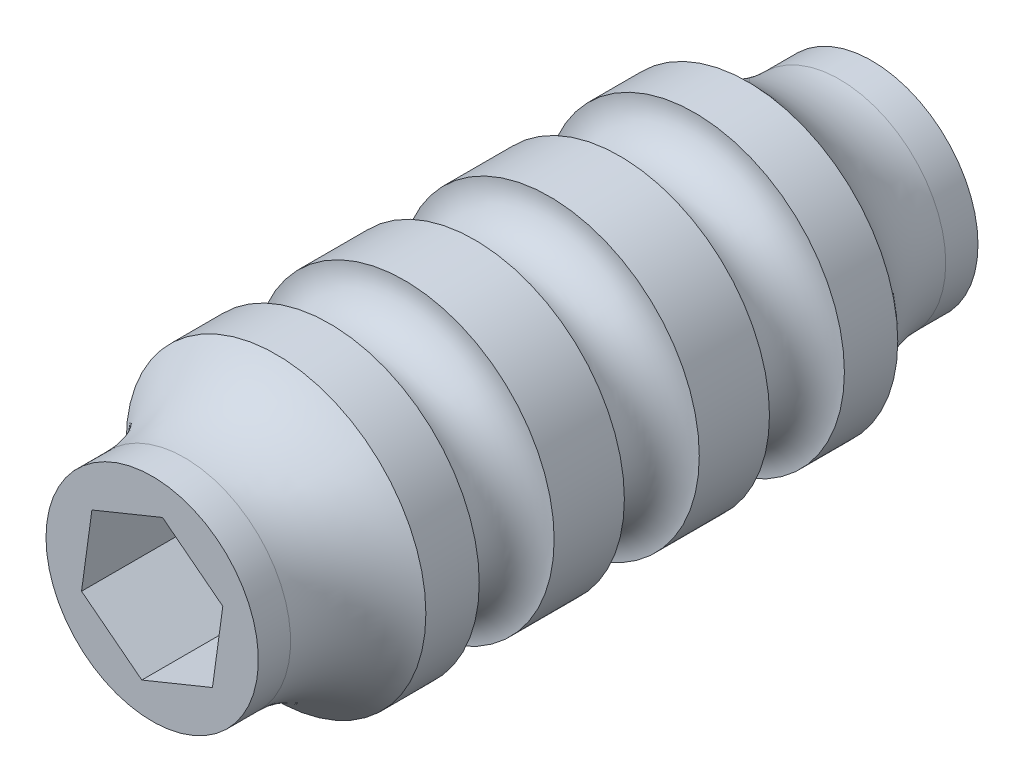
ISO-10303-21;
HEADER;
FILE_DESCRIPTION(('STEP AP214'),'2;1');
FILE_NAME('part.step','',(''),(''),'','','');
FILE_SCHEMA(('AUTOMOTIVE_DESIGN { 1 0 10303 214 1 1 1 1 }'));
ENDSEC;
DATA;
#1=APPLICATION_CONTEXT('core data for automotive mechanical design processes');
#2=APPLICATION_PROTOCOL_DEFINITION('international standard','automotive_design',2000,#1);
#3=PRODUCT_CONTEXT('',#1,'mechanical');
#4=PRODUCT('Part','Part','',(#3));
#5=PRODUCT_RELATED_PRODUCT_CATEGORY('part','',(#4));
#6=PRODUCT_DEFINITION_FORMATION('','',#4);
#7=PRODUCT_DEFINITION_CONTEXT('part definition',#1,'design');
#8=PRODUCT_DEFINITION('design','',#6,#7);
#9=PRODUCT_DEFINITION_SHAPE('','',#8);
#10=(LENGTH_UNIT() NAMED_UNIT(*) SI_UNIT(.MILLI.,.METRE.));
#11=(NAMED_UNIT(*) PLANE_ANGLE_UNIT() SI_UNIT($,.RADIAN.));
#12=(NAMED_UNIT(*) SI_UNIT($,.STERADIAN.) SOLID_ANGLE_UNIT());
#13=UNCERTAINTY_MEASURE_WITH_UNIT(LENGTH_MEASURE(1.E-05),#10,'distance_accuracy_value','');
#14=(GEOMETRIC_REPRESENTATION_CONTEXT(3) GLOBAL_UNCERTAINTY_ASSIGNED_CONTEXT((#13)) GLOBAL_UNIT_ASSIGNED_CONTEXT((#10,
#11,#12)) REPRESENTATION_CONTEXT('',''));
#15=CARTESIAN_POINT('',(0.,0.,0.));
#16=DIRECTION('',(0.,0.,1.));
#17=DIRECTION('',(1.,0.,0.));
#18=AXIS2_PLACEMENT_3D('',#15,#16,#17);
#19=CARTESIAN_POINT('',(0.,0.,0.));
#20=DIRECTION('',(0.,0.,1.));
#21=DIRECTION('',(1.,0.,0.));
#22=AXIS2_PLACEMENT_3D('',#19,#20,#21);
#23=CYLINDRICAL_SURFACE('',#22,12.7);
#24=CARTESIAN_POINT('',(0.,0.,-40.));
#25=DIRECTION('',(0.,0.,1.));
#26=DIRECTION('',(1.,0.,0.));
#27=AXIS2_PLACEMENT_3D('',#24,#25,#26);
#28=CIRCLE('',#27,12.7);
#29=CARTESIAN_POINT('',(12.7,0.,-40.));
#30=VERTEX_POINT('',#29);
#31=EDGE_CURVE('E166',#30,#30,#28,.T.);
#32=ORIENTED_EDGE('',*,*,#31,.T.);
#33=EDGE_LOOP('',(#32));
#34=FACE_BOUND('',#33,.T.);
#35=CARTESIAN_POINT('',(0.,0.,-35.475));
#36=DIRECTION('',(0.,0.,1.));
#37=DIRECTION('',(1.,0.,0.));
#38=AXIS2_PLACEMENT_3D('',#35,#36,#37);
#39=CIRCLE('',#38,12.7);
#40=CARTESIAN_POINT('',(12.7,0.,-35.475));
#41=VERTEX_POINT('',#40);
#42=EDGE_CURVE('E140',#41,#41,#39,.T.);
#43=ORIENTED_EDGE('',*,*,#42,.F.);
#44=EDGE_LOOP('',(#43));
#45=FACE_BOUND('',#44,.T.);
#46=ADVANCED_FACE('F33',(#34,#45),#23,.T.);
#47=CARTESIAN_POINT('',(0.,0.,0.));
#48=DIRECTION('',(0.,0.,1.));
#49=DIRECTION('',(1.,0.,0.));
#50=AXIS2_PLACEMENT_3D('',#47,#48,#49);
#51=CYLINDRICAL_SURFACE('',#50,12.7);
#52=CARTESIAN_POINT('',(0.,0.,-4.525));
#53=DIRECTION('',(0.,0.,1.));
#54=DIRECTION('',(1.,0.,0.));
#55=AXIS2_PLACEMENT_3D('',#52,#53,#54);
#56=CIRCLE('',#55,12.7);
#57=CARTESIAN_POINT('',(12.7,0.,-4.525));
#58=VERTEX_POINT('',#57);
#59=EDGE_CURVE('E160',#58,#58,#56,.T.);
#60=ORIENTED_EDGE('',*,*,#59,.T.);
#61=EDGE_LOOP('',(#60));
#62=FACE_BOUND('',#61,.T.);
#63=CARTESIAN_POINT('',(0.,0.,0.));
#64=DIRECTION('',(0.,0.,1.));
#65=DIRECTION('',(1.,0.,0.));
#66=AXIS2_PLACEMENT_3D('',#63,#64,#65);
#67=CIRCLE('',#66,12.7);
#68=CARTESIAN_POINT('',(12.7,0.,0.));
#69=VERTEX_POINT('',#68);
#70=EDGE_CURVE('E163',#69,#69,#67,.T.);
#71=ORIENTED_EDGE('',*,*,#70,.F.);
#72=EDGE_LOOP('',(#71));
#73=FACE_BOUND('',#72,.T.);
#74=ADVANCED_FACE('F188',(#62,#73),#51,.T.);
#75=CARTESIAN_POINT('',(0.,0.,-7.7));
#76=DIRECTION('',(0.,0.,1.));
#77=DIRECTION('',(1.,0.,0.));
#78=AXIS2_PLACEMENT_3D('',#75,#76,#77);
#79=TOROIDAL_SURFACE('',#78,12.7,3.175);
#80=CARTESIAN_POINT('',(0.,0.,-10.875));
#81=DIRECTION('',(0.,0.,1.));
#82=DIRECTION('',(1.,0.,0.));
#83=AXIS2_PLACEMENT_3D('',#80,#81,#82);
#84=CIRCLE('',#83,12.7);
#85=CARTESIAN_POINT('',(12.7,0.,-10.875));
#86=VERTEX_POINT('',#85);
#87=EDGE_CURVE('E157',#86,#86,#84,.T.);
#88=ORIENTED_EDGE('',*,*,#87,.T.);
#89=EDGE_LOOP('',(#88));
#90=FACE_BOUND('',#89,.T.);
#91=ORIENTED_EDGE('',*,*,#59,.F.);
#92=EDGE_LOOP('',(#91));
#93=FACE_BOUND('',#92,.T.);
#94=ADVANCED_FACE('F193',(#90,#93),#79,.F.);
#95=CARTESIAN_POINT('',(0.,0.,0.));
#96=DIRECTION('',(0.,0.,1.));
#97=DIRECTION('',(1.,0.,0.));
#98=AXIS2_PLACEMENT_3D('',#95,#96,#97);
#99=CYLINDRICAL_SURFACE('',#98,12.7);
#100=CARTESIAN_POINT('',(0.,0.,-16.825));
#101=DIRECTION('',(0.,0.,1.));
#102=DIRECTION('',(1.,0.,0.));
#103=AXIS2_PLACEMENT_3D('',#100,#101,#102);
#104=CIRCLE('',#103,12.7);
#105=CARTESIAN_POINT('',(12.7,0.,-16.825));
#106=VERTEX_POINT('',#105);
#107=EDGE_CURVE('E154',#106,#106,#104,.T.);
#108=ORIENTED_EDGE('',*,*,#107,.T.);
#109=EDGE_LOOP('',(#108));
#110=FACE_BOUND('',#109,.T.);
#111=ORIENTED_EDGE('',*,*,#87,.F.);
#112=EDGE_LOOP('',(#111));
#113=FACE_BOUND('',#112,.T.);
#114=ADVANCED_FACE('F200',(#110,#113),#99,.T.);
#115=CARTESIAN_POINT('',(0.,0.,-20.));
#116=DIRECTION('',(0.,0.,1.));
#117=DIRECTION('',(1.,0.,0.));
#118=AXIS2_PLACEMENT_3D('',#115,#116,#117);
#119=TOROIDAL_SURFACE('',#118,12.7,3.175);
#120=CARTESIAN_POINT('',(0.,0.,-23.175));
#121=DIRECTION('',(0.,0.,1.));
#122=DIRECTION('',(1.,0.,0.));
#123=AXIS2_PLACEMENT_3D('',#120,#121,#122);
#124=CIRCLE('',#123,12.7);
#125=CARTESIAN_POINT('',(12.7,0.,-23.175));
#126=VERTEX_POINT('',#125);
#127=EDGE_CURVE('E151',#126,#126,#124,.T.);
#128=ORIENTED_EDGE('',*,*,#127,.T.);
#129=EDGE_LOOP('',(#128));
#130=FACE_BOUND('',#129,.T.);
#131=ORIENTED_EDGE('',*,*,#107,.F.);
#132=EDGE_LOOP('',(#131));
#133=FACE_BOUND('',#132,.T.);
#134=ADVANCED_FACE('F204',(#130,#133),#119,.F.);
#135=CARTESIAN_POINT('',(0.,0.,0.));
#136=DIRECTION('',(0.,0.,1.));
#137=DIRECTION('',(1.,0.,0.));
#138=AXIS2_PLACEMENT_3D('',#135,#136,#137);
#139=CYLINDRICAL_SURFACE('',#138,12.7);
#140=CARTESIAN_POINT('',(0.,0.,-29.125));
#141=DIRECTION('',(0.,0.,1.));
#142=DIRECTION('',(1.,0.,0.));
#143=AXIS2_PLACEMENT_3D('',#140,#141,#142);
#144=CIRCLE('',#143,12.7);
#145=CARTESIAN_POINT('',(12.7,0.,-29.125));
#146=VERTEX_POINT('',#145);
#147=EDGE_CURVE('E148',#146,#146,#144,.T.);
#148=ORIENTED_EDGE('',*,*,#147,.T.);
#149=EDGE_LOOP('',(#148));
#150=FACE_BOUND('',#149,.T.);
#151=ORIENTED_EDGE('',*,*,#127,.F.);
#152=EDGE_LOOP('',(#151));
#153=FACE_BOUND('',#152,.T.);
#154=ADVANCED_FACE('F208',(#150,#153),#139,.T.);
#155=CARTESIAN_POINT('',(0.,0.,-32.3));
#156=DIRECTION('',(0.,0.,1.));
#157=DIRECTION('',(1.,0.,0.));
#158=AXIS2_PLACEMENT_3D('',#155,#156,#157);
#159=TOROIDAL_SURFACE('',#158,12.7,3.175);
#160=ORIENTED_EDGE('',*,*,#42,.T.);
#161=EDGE_LOOP('',(#160));
#162=FACE_BOUND('',#161,.T.);
#163=ORIENTED_EDGE('',*,*,#147,.F.);
#164=EDGE_LOOP('',(#163));
#165=FACE_BOUND('',#164,.T.);
#166=ADVANCED_FACE('F212',(#162,#165),#159,.F.);
#167=CARTESIAN_POINT('',(-5.10913658499433,3.96359138777016,0.));
#168=DIRECTION('',(-0.377779825487619,0.925895460327214,0.));
#169=DIRECTION('',(-0.925895460327215,-0.377779825487619,0.));
#170=AXIS2_PLACEMENT_3D('',#167,#168,#169);
#171=PLANE('',#170);
#172=DIRECTION('',(0.,0.,-1.));
#173=VECTOR('',#172,1.);
#174=CARTESIAN_POINT('',(-5.10913658499433,3.96359138777016,0.));
#175=LINE('',#174,#173);
#176=CARTESIAN_POINT('',(-5.10913658499433,3.96359138777016,10.5));
#177=VERTEX_POINT('',#176);
#178=CARTESIAN_POINT('',(-5.10913658499433,3.96359138777016,-50.5));
#179=VERTEX_POINT('',#178);
#180=EDGE_CURVE('E48',#177,#179,#175,.T.);
#181=ORIENTED_EDGE('',*,*,#180,.T.);
#182=DIRECTION('',(0.925895460327214,0.377779825487619,0.));
#183=VECTOR('',#182,1.);
#184=CARTESIAN_POINT('',(-5.10913658499433,3.96359138777016,-50.5));
#185=LINE('',#184,#183);
#186=CARTESIAN_POINT('',(0.878002539533004,6.40643776789465,-50.5));
#187=VERTEX_POINT('',#186);
#188=EDGE_CURVE('E134',#179,#187,#185,.T.);
#189=ORIENTED_EDGE('',*,*,#188,.T.);
#190=DIRECTION('',(0.,0.,-1.));
#191=VECTOR('',#190,1.);
#192=CARTESIAN_POINT('',(0.878002539533005,6.40643776789465,0.));
#193=LINE('',#192,#191);
#194=CARTESIAN_POINT('',(0.878002539533004,6.40643776789465,10.5));
#195=VERTEX_POINT('',#194);
#196=EDGE_CURVE('E56',#195,#187,#193,.T.);
#197=ORIENTED_EDGE('',*,*,#196,.F.);
#198=DIRECTION('',(-0.925895460327214,-0.377779825487619,0.));
#199=VECTOR('',#198,1.);
#200=CARTESIAN_POINT('',(0.878002539533004,6.40643776789465,10.5));
#201=LINE('',#200,#199);
#202=EDGE_CURVE('E112',#195,#177,#201,.T.);
#203=ORIENTED_EDGE('',*,*,#202,.T.);
#204=EDGE_LOOP('',(#181,#189,#197,#203));
#205=FACE_BOUND('',#204,.T.);
#206=ADVANCED_FACE('F216',(#205),#171,.F.);
#207=CARTESIAN_POINT('',(-5.98713912452734,-2.44284638012449,0.));
#208=DIRECTION('',(-0.990738902635864,0.135780804254077,0.));
#209=DIRECTION('',(-0.135780804254077,-0.990738902635864,0.));
#210=AXIS2_PLACEMENT_3D('',#207,#208,#209);
#211=PLANE('',#210);
#212=DIRECTION('',(0.,0.,-1.));
#213=VECTOR('',#212,1.);
#214=CARTESIAN_POINT('',(-5.98713912452734,-2.44284638012449,0.));
#215=LINE('',#214,#213);
#216=CARTESIAN_POINT('',(-5.98713912452734,-2.44284638012449,10.5));
#217=VERTEX_POINT('',#216);
#218=CARTESIAN_POINT('',(-5.98713912452734,-2.44284638012449,-50.5));
#219=VERTEX_POINT('',#218);
#220=EDGE_CURVE('E141',#217,#219,#215,.T.);
#221=ORIENTED_EDGE('',*,*,#220,.T.);
#222=DIRECTION('',(0.135780804254077,0.990738902635864,0.));
#223=VECTOR('',#222,1.);
#224=CARTESIAN_POINT('',(-5.98713912452734,-2.44284638012449,-50.5));
#225=LINE('',#224,#223);
#226=EDGE_CURVE('E132',#219,#179,#225,.T.);
#227=ORIENTED_EDGE('',*,*,#226,.T.);
#228=ORIENTED_EDGE('',*,*,#180,.F.);
#229=DIRECTION('',(-0.135780804254077,-0.990738902635864,0.));
#230=VECTOR('',#229,1.);
#231=CARTESIAN_POINT('',(-5.10913658499433,3.96359138777016,10.5));
#232=LINE('',#231,#230);
#233=EDGE_CURVE('E116',#177,#217,#232,.T.);
#234=ORIENTED_EDGE('',*,*,#233,.T.);
#235=EDGE_LOOP('',(#221,#227,#228,#234));
#236=FACE_BOUND('',#235,.T.);
#237=ADVANCED_FACE('F220',(#236),#211,.F.);
#238=CARTESIAN_POINT('',(-0.878002539533006,-6.40643776789464,0.));
#239=DIRECTION('',(-0.612959077148245,-0.790114656073137,0.));
#240=DIRECTION('',(0.790114656073137,-0.612959077148245,0.));
#241=AXIS2_PLACEMENT_3D('',#238,#239,#240);
#242=PLANE('',#241);
#243=DIRECTION('',(0.,0.,-1.));
#244=VECTOR('',#243,1.);
#245=CARTESIAN_POINT('',(-0.878002539533006,-6.40643776789464,0.));
#246=LINE('',#245,#244);
#247=CARTESIAN_POINT('',(-0.878002539533006,-6.40643776789464,10.5));
#248=VERTEX_POINT('',#247);
#249=CARTESIAN_POINT('',(-0.878002539533006,-6.40643776789464,-50.5));
#250=VERTEX_POINT('',#249);
#251=EDGE_CURVE('E98',#248,#250,#246,.T.);
#252=ORIENTED_EDGE('',*,*,#251,.T.);
#253=DIRECTION('',(-0.790114656073137,0.612959077148245,0.));
#254=VECTOR('',#253,1.);
#255=CARTESIAN_POINT('',(-0.878002539533006,-6.40643776789464,-50.5));
#256=LINE('',#255,#254);
#257=EDGE_CURVE('E129',#250,#219,#256,.T.);
#258=ORIENTED_EDGE('',*,*,#257,.T.);
#259=ORIENTED_EDGE('',*,*,#220,.F.);
#260=DIRECTION('',(0.790114656073137,-0.612959077148245,0.));
#261=VECTOR('',#260,1.);
#262=CARTESIAN_POINT('',(-5.98713912452734,-2.44284638012449,10.5));
#263=LINE('',#262,#261);
#264=EDGE_CURVE('E119',#217,#248,#263,.T.);
#265=ORIENTED_EDGE('',*,*,#264,.T.);
#266=EDGE_LOOP('',(#252,#258,#259,#265));
#267=FACE_BOUND('',#266,.T.);
#268=ADVANCED_FACE('F229',(#267),#242,.F.);
#269=CARTESIAN_POINT('',(5.10913658499433,-3.96359138777016,0.));
#270=DIRECTION('',(0.377779825487619,-0.925895460327214,0.));
#271=DIRECTION('',(0.925895460327215,0.377779825487619,0.));
#272=AXIS2_PLACEMENT_3D('',#269,#270,#271);
#273=PLANE('',#272);
#274=DIRECTION('',(0.,0.,-1.));
#275=VECTOR('',#274,1.);
#276=CARTESIAN_POINT('',(5.10913658499433,-3.96359138777016,0.));
#277=LINE('',#276,#275);
#278=CARTESIAN_POINT('',(5.10913658499433,-3.96359138777016,10.5));
#279=VERTEX_POINT('',#278);
#280=CARTESIAN_POINT('',(5.10913658499433,-3.96359138777016,-50.5));
#281=VERTEX_POINT('',#280);
#282=EDGE_CURVE('E87',#279,#281,#277,.T.);
#283=ORIENTED_EDGE('',*,*,#282,.T.);
#284=DIRECTION('',(-0.925895460327214,-0.377779825487619,0.));
#285=VECTOR('',#284,1.);
#286=CARTESIAN_POINT('',(5.10913658499433,-3.96359138777016,-50.5));
#287=LINE('',#286,#285);
#288=EDGE_CURVE('E127',#281,#250,#287,.T.);
#289=ORIENTED_EDGE('',*,*,#288,.T.);
#290=ORIENTED_EDGE('',*,*,#251,.F.);
#291=DIRECTION('',(0.925895460327214,0.377779825487619,0.));
#292=VECTOR('',#291,1.);
#293=CARTESIAN_POINT('',(-0.878002539533006,-6.40643776789464,10.5));
#294=LINE('',#293,#292);
#295=EDGE_CURVE('E102',#248,#279,#294,.T.);
#296=ORIENTED_EDGE('',*,*,#295,.T.);
#297=EDGE_LOOP('',(#283,#289,#290,#296));
#298=FACE_BOUND('',#297,.T.);
#299=ADVANCED_FACE('F103',(#298),#273,.F.);
#300=CARTESIAN_POINT('',(5.98713912452734,2.44284638012449,0.));
#301=DIRECTION('',(0.990738902635864,-0.135780804254077,0.));
#302=DIRECTION('',(0.135780804254077,0.990738902635864,0.));
#303=AXIS2_PLACEMENT_3D('',#300,#301,#302);
#304=PLANE('',#303);
#305=DIRECTION('',(0.,0.,-1.));
#306=VECTOR('',#305,1.);
#307=CARTESIAN_POINT('',(5.98713912452734,2.44284638012449,0.));
#308=LINE('',#307,#306);
#309=CARTESIAN_POINT('',(5.98713912452734,2.44284638012449,10.5));
#310=VERTEX_POINT('',#309);
#311=CARTESIAN_POINT('',(5.98713912452734,2.44284638012449,-50.5));
#312=VERTEX_POINT('',#311);
#313=EDGE_CURVE('E99',#310,#312,#308,.T.);
#314=ORIENTED_EDGE('',*,*,#313,.T.);
#315=DIRECTION('',(-0.135780804254077,-0.990738902635864,0.));
#316=VECTOR('',#315,1.);
#317=CARTESIAN_POINT('',(5.98713912452734,2.44284638012449,-50.5));
#318=LINE('',#317,#316);
#319=EDGE_CURVE('E94',#312,#281,#318,.T.);
#320=ORIENTED_EDGE('',*,*,#319,.T.);
#321=ORIENTED_EDGE('',*,*,#282,.F.);
#322=DIRECTION('',(0.135780804254077,0.990738902635864,0.));
#323=VECTOR('',#322,1.);
#324=CARTESIAN_POINT('',(5.10913658499433,-3.96359138777016,10.5));
#325=LINE('',#324,#323);
#326=EDGE_CURVE('E91',#279,#310,#325,.T.);
#327=ORIENTED_EDGE('',*,*,#326,.T.);
#328=EDGE_LOOP('',(#314,#320,#321,#327));
#329=FACE_BOUND('',#328,.T.);
#330=ADVANCED_FACE('F89',(#329),#304,.F.);
#331=CARTESIAN_POINT('',(0.878002539533005,6.40643776789465,0.));
#332=DIRECTION('',(0.612959077148245,0.790114656073137,0.));
#333=DIRECTION('',(-0.790114656073137,0.612959077148245,0.));
#334=AXIS2_PLACEMENT_3D('',#331,#332,#333);
#335=PLANE('',#334);
#336=ORIENTED_EDGE('',*,*,#196,.T.);
#337=DIRECTION('',(0.790114656073137,-0.612959077148246,0.));
#338=VECTOR('',#337,1.);
#339=CARTESIAN_POINT('',(0.878002539533004,6.40643776789465,-50.5));
#340=LINE('',#339,#338);
#341=EDGE_CURVE('E124',#187,#312,#340,.T.);
#342=ORIENTED_EDGE('',*,*,#341,.T.);
#343=ORIENTED_EDGE('',*,*,#313,.F.);
#344=DIRECTION('',(-0.790114656073137,0.612959077148246,0.));
#345=VECTOR('',#344,1.);
#346=CARTESIAN_POINT('',(5.98713912452734,2.44284638012449,10.5));
#347=LINE('',#346,#345);
#348=EDGE_CURVE('E110',#310,#195,#347,.T.);
#349=ORIENTED_EDGE('',*,*,#348,.T.);
#350=EDGE_LOOP('',(#336,#342,#343,#349));
#351=FACE_BOUND('',#350,.T.);
#352=ADVANCED_FACE('F221',(#351),#335,.F.);
#353=CARTESIAN_POINT('',(0.,0.,-50.5));
#354=DIRECTION('',(0.,0.,-1.));
#355=DIRECTION('',(-1.,0.,0.));
#356=AXIS2_PLACEMENT_3D('',#353,#354,#355);
#357=PLANE('',#356);
#358=CARTESIAN_POINT('',(0.,0.,-50.5));
#359=DIRECTION('',(0.,0.,-1.));
#360=DIRECTION('',(-1.,0.,0.));
#361=AXIS2_PLACEMENT_3D('',#358,#359,#360);
#362=CIRCLE('',#361,9.);
#363=CARTESIAN_POINT('',(9.,0.,-50.5));
#364=VERTEX_POINT('',#363);
#365=EDGE_CURVE('E136',#364,#364,#362,.T.);
#366=ORIENTED_EDGE('',*,*,#365,.T.);
#367=EDGE_LOOP('',(#366));
#368=FACE_BOUND('',#367,.T.);
#369=ORIENTED_EDGE('',*,*,#319,.F.);
#370=ORIENTED_EDGE('',*,*,#341,.F.);
#371=ORIENTED_EDGE('',*,*,#188,.F.);
#372=ORIENTED_EDGE('',*,*,#226,.F.);
#373=ORIENTED_EDGE('',*,*,#257,.F.);
#374=ORIENTED_EDGE('',*,*,#288,.F.);
#375=EDGE_LOOP('',(#369,#370,#371,#372,#373,#374));
#376=FACE_BOUND('',#375,.T.);
#377=ADVANCED_FACE('F224',(#368,#376),#357,.T.);
#378=CARTESIAN_POINT('',(0.,0.,-50.5));
#379=DIRECTION('',(0.,0.,1.));
#380=DIRECTION('',(1.,0.,0.));
#381=AXIS2_PLACEMENT_3D('',#378,#379,#380);
#382=CYLINDRICAL_SURFACE('',#381,9.);
#383=CARTESIAN_POINT('',(0.,0.,-47.7659513261416));
#384=DIRECTION('',(0.,0.,1.));
#385=DIRECTION('',(1.,0.,0.));
#386=AXIS2_PLACEMENT_3D('',#383,#384,#385);
#387=CIRCLE('',#386,9.);
#388=CARTESIAN_POINT('',(9.,0.,-47.7659513261416));
#389=VERTEX_POINT('',#388);
#390=EDGE_CURVE('E41',#389,#389,#387,.F.);
#391=CARTESIAN_POINT('',(9.,0.,-47.7659513261416));
#392=CARTESIAN_POINT('',(9.,0.,-47.7944309998276));
#393=CARTESIAN_POINT('',(9.,0.,-47.8229106735136));
#394=CARTESIAN_POINT('',(9.,0.,-47.8798700208857));
#395=CARTESIAN_POINT('',(9.,0.,-47.9083496945717));
#396=CARTESIAN_POINT('',(9.,0.,-47.9653090419437));
#397=CARTESIAN_POINT('',(9.,0.,-47.9937887156298));
#398=CARTESIAN_POINT('',(9.,0.,-48.0507480630018));
#399=CARTESIAN_POINT('',(9.,0.,-48.0792277366878));
#400=CARTESIAN_POINT('',(9.,0.,-48.1361870840599));
#401=CARTESIAN_POINT('',(9.,0.,-48.1646667577459));
#402=CARTESIAN_POINT('',(9.,0.,-48.221626105118));
#403=CARTESIAN_POINT('',(9.,0.,-48.250105778804));
#404=CARTESIAN_POINT('',(9.,0.,-48.307065126176));
#405=CARTESIAN_POINT('',(9.,0.,-48.3355447998621));
#406=CARTESIAN_POINT('',(9.,0.,-48.3925041472341));
#407=CARTESIAN_POINT('',(9.,0.,-48.4209838209201));
#408=CARTESIAN_POINT('',(9.,0.,-48.4779431682922));
#409=CARTESIAN_POINT('',(9.,0.,-48.5064228419782));
#410=CARTESIAN_POINT('',(9.,0.,-48.5633821893503));
#411=CARTESIAN_POINT('',(9.,0.,-48.5918618630363));
#412=CARTESIAN_POINT('',(9.,0.,-48.6488212104084));
#413=CARTESIAN_POINT('',(9.,0.,-48.6773008840944));
#414=CARTESIAN_POINT('',(9.,0.,-48.7342602314664));
#415=CARTESIAN_POINT('',(9.,0.,-48.7627399051525));
#416=CARTESIAN_POINT('',(9.,0.,-48.8196992525245));
#417=CARTESIAN_POINT('',(9.,0.,-48.8481789262105));
#418=CARTESIAN_POINT('',(9.,0.,-48.9051382735826));
#419=CARTESIAN_POINT('',(9.,0.,-48.9336179472686));
#420=CARTESIAN_POINT('',(9.,0.,-48.9905772946407));
#421=CARTESIAN_POINT('',(9.,0.,-49.0190569683267));
#422=CARTESIAN_POINT('',(9.,0.,-49.0760163156987));
#423=CARTESIAN_POINT('',(9.,0.,-49.1044959893848));
#424=CARTESIAN_POINT('',(9.,0.,-49.1614553367568));
#425=CARTESIAN_POINT('',(9.,0.,-49.1899350104428));
#426=CARTESIAN_POINT('',(9.,0.,-49.2468943578149));
#427=CARTESIAN_POINT('',(9.,0.,-49.2753740315009));
#428=CARTESIAN_POINT('',(9.,0.,-49.332333378873));
#429=CARTESIAN_POINT('',(9.,0.,-49.360813052559));
#430=CARTESIAN_POINT('',(9.,0.,-49.417772399931));
#431=CARTESIAN_POINT('',(9.,0.,-49.4462520736171));
#432=CARTESIAN_POINT('',(9.,0.,-49.5032114209891));
#433=CARTESIAN_POINT('',(9.,0.,-49.5316910946751));
#434=CARTESIAN_POINT('',(9.,0.,-49.5886504420472));
#435=CARTESIAN_POINT('',(9.,0.,-49.6171301157332));
#436=CARTESIAN_POINT('',(9.,0.,-49.6740894631053));
#437=CARTESIAN_POINT('',(9.,0.,-49.7025691367913));
#438=CARTESIAN_POINT('',(9.,0.,-49.7595284841633));
#439=CARTESIAN_POINT('',(9.,0.,-49.7880081578494));
#440=CARTESIAN_POINT('',(9.,0.,-49.8449675052214));
#441=CARTESIAN_POINT('',(9.,0.,-49.8734471789074));
#442=CARTESIAN_POINT('',(9.,0.,-49.9304065262795));
#443=CARTESIAN_POINT('',(9.,0.,-49.9588861999655));
#444=CARTESIAN_POINT('',(9.,0.,-50.0158455473376));
#445=CARTESIAN_POINT('',(9.,0.,-50.0443252210236));
#446=CARTESIAN_POINT('',(9.,0.,-50.1012845683956));
#447=CARTESIAN_POINT('',(9.,0.,-50.1297642420817));
#448=CARTESIAN_POINT('',(9.,0.,-50.1867235894537));
#449=CARTESIAN_POINT('',(9.,0.,-50.2152032631397));
#450=CARTESIAN_POINT('',(9.,0.,-50.2721626105118));
#451=CARTESIAN_POINT('',(9.,0.,-50.3006422841978));
#452=CARTESIAN_POINT('',(9.,0.,-50.3576016315699));
#453=CARTESIAN_POINT('',(9.,0.,-50.3860813052559));
#454=CARTESIAN_POINT('',(9.,0.,-50.4430406526279));
#455=CARTESIAN_POINT('',(9.,0.,-50.471520326314));
#456=CARTESIAN_POINT('',(9.,0.,-50.5));
#457=B_SPLINE_CURVE_WITH_KNOTS('',3,(#391,#392,#393,#394,#395,#396,#397,#398,#399,#400,#401,
#402,#403,#404,#405,#406,#407,#408,#409,#410,#411,#412,#413,#414,#415,#416,#417,#418,#419,#420,
#421,#422,#423,#424,#425,#426,#427,#428,#429,#430,#431,#432,#433,#434,#435,#436,#437,#438,#439,
#440,#441,#442,#443,#444,#445,#446,#447,#448,#449,#450,#451,#452,#453,#454,#455,#456),
.UNSPECIFIED.,.F.,.F.,(4,2,2,2,2,2,2,2,2,2,2,2,2,2,2,2,2,2,2,2,2,2,2,2,2,2,2,2,2,2,2,2,4),(0.,
0.0854390210580785,0.170878042116157,0.256317063174229,0.341756084232307,0.427195105290386,
0.512634126348457,0.598073147406536,0.683512168464607,0.768951189522686,0.854390210580765,
0.939829231638836,1.02526825269691,1.11070727375499,1.19614629481307,1.28158531587114,
1.36702433692921,1.45246335798729,1.53790237904537,1.62334140010344,1.70878042116152,
1.7942194422196,1.87965846327767,1.96509748433575,2.05053650539383,2.1359755264519,
2.22141454750998,2.30685356856805,2.39229258962613,2.47773161068421,2.56317063174228,
2.64860965280036,2.73404867385844),.UNSPECIFIED.);
#458=EDGE_CURVE('BSEAM171',#389,#364,#457,.T.);
#459=ORIENTED_EDGE('',*,*,#390,.T.);
#460=ORIENTED_EDGE('',*,*,#365,.F.);
#461=ORIENTED_EDGE('',*,*,#458,.T.);
#462=ORIENTED_EDGE('',*,*,#458,.F.);
#463=EDGE_LOOP('',(#459,#461,#460,#462));
#464=FACE_BOUND('',#463,.T.);
#465=ADVANCED_FACE('F171',(#464),#382,.T.);
#466=CARTESIAN_POINT('',(0.,0.,10.5));
#467=DIRECTION('',(0.,0.,1.));
#468=DIRECTION('',(1.,0.,0.));
#469=AXIS2_PLACEMENT_3D('',#466,#467,#468);
#470=PLANE('',#469);
#471=CARTESIAN_POINT('',(0.,0.,10.5));
#472=DIRECTION('',(0.,0.,1.));
#473=DIRECTION('',(1.,0.,0.));
#474=AXIS2_PLACEMENT_3D('',#471,#472,#473);
#475=CIRCLE('',#474,9.);
#476=CARTESIAN_POINT('',(-9.,0.,10.5));
#477=VERTEX_POINT('',#476);
#478=EDGE_CURVE('E121',#477,#477,#475,.T.);
#479=ORIENTED_EDGE('',*,*,#478,.T.);
#480=EDGE_LOOP('',(#479));
#481=FACE_BOUND('',#480,.T.);
#482=ORIENTED_EDGE('',*,*,#326,.F.);
#483=ORIENTED_EDGE('',*,*,#295,.F.);
#484=ORIENTED_EDGE('',*,*,#264,.F.);
#485=ORIENTED_EDGE('',*,*,#233,.F.);
#486=ORIENTED_EDGE('',*,*,#202,.F.);
#487=ORIENTED_EDGE('',*,*,#348,.F.);
#488=EDGE_LOOP('',(#482,#483,#484,#485,#486,#487));
#489=FACE_BOUND('',#488,.T.);
#490=ADVANCED_FACE('F108',(#481,#489),#470,.T.);
#491=CARTESIAN_POINT('',(0.,0.,10.5));
#492=DIRECTION('',(0.,0.,-1.));
#493=DIRECTION('',(-1.,0.,0.));
#494=AXIS2_PLACEMENT_3D('',#491,#492,#493);
#495=CYLINDRICAL_SURFACE('',#494,9.);
#496=CARTESIAN_POINT('',(0.,0.,7.76595132614157));
#497=DIRECTION('',(0.,0.,-1.));
#498=DIRECTION('',(-1.,0.,0.));
#499=AXIS2_PLACEMENT_3D('',#496,#497,#498);
#500=CIRCLE('',#499,9.);
#501=CARTESIAN_POINT('',(-9.,0.,7.76595132614157));
#502=VERTEX_POINT('',#501);
#503=EDGE_CURVE('E11',#502,#502,#500,.F.);
#504=CARTESIAN_POINT('',(-9.,0.,7.76595132614157));
#505=CARTESIAN_POINT('',(-9.,0.,7.79443099982759));
#506=CARTESIAN_POINT('',(-9.,0.,7.82291067351362));
#507=CARTESIAN_POINT('',(-9.,0.,7.87987002088567));
#508=CARTESIAN_POINT('',(-9.,0.,7.90834969457169));
#509=CARTESIAN_POINT('',(-9.,0.,7.96530904194374));
#510=CARTESIAN_POINT('',(-9.,0.,7.99378871562977));
#511=CARTESIAN_POINT('',(-9.,0.,8.05074806300182));
#512=CARTESIAN_POINT('',(-9.,0.,8.07922773668785));
#513=CARTESIAN_POINT('',(-9.,0.,8.1361870840599));
#514=CARTESIAN_POINT('',(-9.,0.,8.16466675774592));
#515=CARTESIAN_POINT('',(-9.,0.,8.22162610511797));
#516=CARTESIAN_POINT('',(-9.,0.,8.250105778804));
#517=CARTESIAN_POINT('',(-9.,0.,8.30706512617605));
#518=CARTESIAN_POINT('',(-9.,0.,8.33554479986207));
#519=CARTESIAN_POINT('',(-9.,0.,8.39250414723412));
#520=CARTESIAN_POINT('',(-9.,0.,8.42098382092015));
#521=CARTESIAN_POINT('',(-9.,0.,8.4779431682922));
#522=CARTESIAN_POINT('',(-9.,0.,8.50642284197823));
#523=CARTESIAN_POINT('',(-9.,0.,8.56338218935028));
#524=CARTESIAN_POINT('',(-9.,0.,8.5918618630363));
#525=CARTESIAN_POINT('',(-9.,0.,8.64882121040835));
#526=CARTESIAN_POINT('',(-9.,0.,8.67730088409438));
#527=CARTESIAN_POINT('',(-9.,0.,8.73426023146643));
#528=CARTESIAN_POINT('',(-9.,0.,8.76273990515245));
#529=CARTESIAN_POINT('',(-9.,0.,8.8196992525245));
#530=CARTESIAN_POINT('',(-9.,0.,8.84817892621053));
#531=CARTESIAN_POINT('',(-9.,0.,8.90513827358258));
#532=CARTESIAN_POINT('',(-9.,0.,8.9336179472686));
#533=CARTESIAN_POINT('',(-9.,0.,8.99057729464066));
#534=CARTESIAN_POINT('',(-9.,0.,9.01905696832668));
#535=CARTESIAN_POINT('',(-9.,0.,9.07601631569873));
#536=CARTESIAN_POINT('',(-9.,0.,9.10449598938476));
#537=CARTESIAN_POINT('',(-9.,0.,9.16145533675681));
#538=CARTESIAN_POINT('',(-9.,0.,9.18993501044283));
#539=CARTESIAN_POINT('',(-9.,0.,9.24689435781488));
#540=CARTESIAN_POINT('',(-9.,0.,9.27537403150091));
#541=CARTESIAN_POINT('',(-9.,0.,9.33233337887296));
#542=CARTESIAN_POINT('',(-9.,0.,9.36081305255898));
#543=CARTESIAN_POINT('',(-9.,0.,9.41777239993104));
#544=CARTESIAN_POINT('',(-9.,0.,9.44625207361706));
#545=CARTESIAN_POINT('',(-9.,0.,9.50321142098911));
#546=CARTESIAN_POINT('',(-9.,0.,9.53169109467514));
#547=CARTESIAN_POINT('',(-9.,0.,9.58865044204719));
#548=CARTESIAN_POINT('',(-9.,0.,9.61713011573321));
#549=CARTESIAN_POINT('',(-9.,0.,9.67408946310526));
#550=CARTESIAN_POINT('',(-9.,0.,9.70256913679129));
#551=CARTESIAN_POINT('',(-9.,0.,9.75952848416334));
#552=CARTESIAN_POINT('',(-9.,0.,9.78800815784937));
#553=CARTESIAN_POINT('',(-9.,0.,9.84496750522142));
#554=CARTESIAN_POINT('',(-9.,0.,9.87344717890744));
#555=CARTESIAN_POINT('',(-9.,0.,9.93040652627949));
#556=CARTESIAN_POINT('',(-9.,0.,9.95888619996552));
#557=CARTESIAN_POINT('',(-9.,0.,10.0158455473376));
#558=CARTESIAN_POINT('',(-9.,0.,10.0443252210236));
#559=CARTESIAN_POINT('',(-9.,0.,10.1012845683956));
#560=CARTESIAN_POINT('',(-9.,0.,10.1297642420817));
#561=CARTESIAN_POINT('',(-9.,0.,10.1867235894537));
#562=CARTESIAN_POINT('',(-9.,0.,10.2152032631397));
#563=CARTESIAN_POINT('',(-9.,0.,10.2721626105118));
#564=CARTESIAN_POINT('',(-9.,0.,10.3006422841978));
#565=CARTESIAN_POINT('',(-9.,0.,10.3576016315699));
#566=CARTESIAN_POINT('',(-9.,0.,10.3860813052559));
#567=CARTESIAN_POINT('',(-9.,0.,10.4430406526279));
#568=CARTESIAN_POINT('',(-9.,0.,10.471520326314));
#569=CARTESIAN_POINT('',(-9.,0.,10.5));
#570=B_SPLINE_CURVE_WITH_KNOTS('',3,(#504,#505,#506,#507,#508,#509,#510,#511,#512,#513,#514,
#515,#516,#517,#518,#519,#520,#521,#522,#523,#524,#525,#526,#527,#528,#529,#530,#531,#532,#533,
#534,#535,#536,#537,#538,#539,#540,#541,#542,#543,#544,#545,#546,#547,#548,#549,#550,#551,#552,
#553,#554,#555,#556,#557,#558,#559,#560,#561,#562,#563,#564,#565,#566,#567,#568,#569),
.UNSPECIFIED.,.F.,.F.,(4,2,2,2,2,2,2,2,2,2,2,2,2,2,2,2,2,2,2,2,2,2,2,2,2,2,2,2,2,2,2,2,4),(0.,
0.0854390210580751,0.170878042116152,0.256317063174227,0.341756084232304,0.427195105290381,
0.512634126348456,0.598073147406533,0.683512168464607,0.768951189522684,0.854390210580759,
0.939829231638836,1.02526825269691,1.11070727375499,1.19614629481306,1.28158531587114,
1.36702433692922,1.45246335798729,1.53790237904537,1.62334140010344,1.70878042116152,
1.7942194422196,1.87965846327767,1.96509748433575,2.05053650539382,2.1359755264519,
2.22141454750998,2.30685356856805,2.39229258962613,2.4777316106842,2.56317063174228,
2.64860965280036,2.73404867385843),.UNSPECIFIED.);
#571=EDGE_CURVE('BSEAM176',#502,#477,#570,.T.);
#572=ORIENTED_EDGE('',*,*,#503,.T.);
#573=ORIENTED_EDGE('',*,*,#478,.F.);
#574=ORIENTED_EDGE('',*,*,#571,.T.);
#575=ORIENTED_EDGE('',*,*,#571,.F.);
#576=EDGE_LOOP('',(#572,#574,#573,#575));
#577=FACE_BOUND('',#576,.T.);
#578=ADVANCED_FACE('F176',(#577),#495,.T.);
#579=CARTESIAN_POINT('',(0.,0.,-47.7659513261416));
#580=DIRECTION('',(0.,0.,1.));
#581=DIRECTION('',(1.,0.,0.));
#582=AXIS2_PLACEMENT_3D('',#579,#580,#581);
#583=TOROIDAL_SURFACE('',#582,19.,10.);
#584=ORIENTED_EDGE('',*,*,#31,.F.);
#585=EDGE_LOOP('',(#584));
#586=FACE_BOUND('',#585,.T.);
#587=ORIENTED_EDGE('',*,*,#390,.F.);
#588=EDGE_LOOP('',(#587));
#589=FACE_BOUND('',#588,.T.);
#590=ADVANCED_FACE('F174',(#586,#589),#583,.F.);
#591=CARTESIAN_POINT('',(0.,0.,7.76595132614157));
#592=DIRECTION('',(0.,0.,-1.));
#593=DIRECTION('',(-1.,0.,0.));
#594=AXIS2_PLACEMENT_3D('',#591,#592,#593);
#595=TOROIDAL_SURFACE('',#594,19.,10.);
#596=ORIENTED_EDGE('',*,*,#70,.T.);
#597=EDGE_LOOP('',(#596));
#598=FACE_BOUND('',#597,.T.);
#599=ORIENTED_EDGE('',*,*,#503,.F.);
#600=EDGE_LOOP('',(#599));
#601=FACE_BOUND('',#600,.T.);
#602=ADVANCED_FACE('F35',(#598,#601),#595,.F.);
#603=CLOSED_SHELL('',(#46,#74,#94,#114,#134,#154,#166,#206,#237,#268,#299,#330,#352,#377,#465,
#490,#578,#590,#602));
#604=MANIFOLD_SOLID_BREP('B2',#603);
#605=ADVANCED_BREP_SHAPE_REPRESENTATION('',(#18,#604),#14);
#606=SHAPE_DEFINITION_REPRESENTATION(#9,#605);
ENDSEC;
END-ISO-10303-21;
